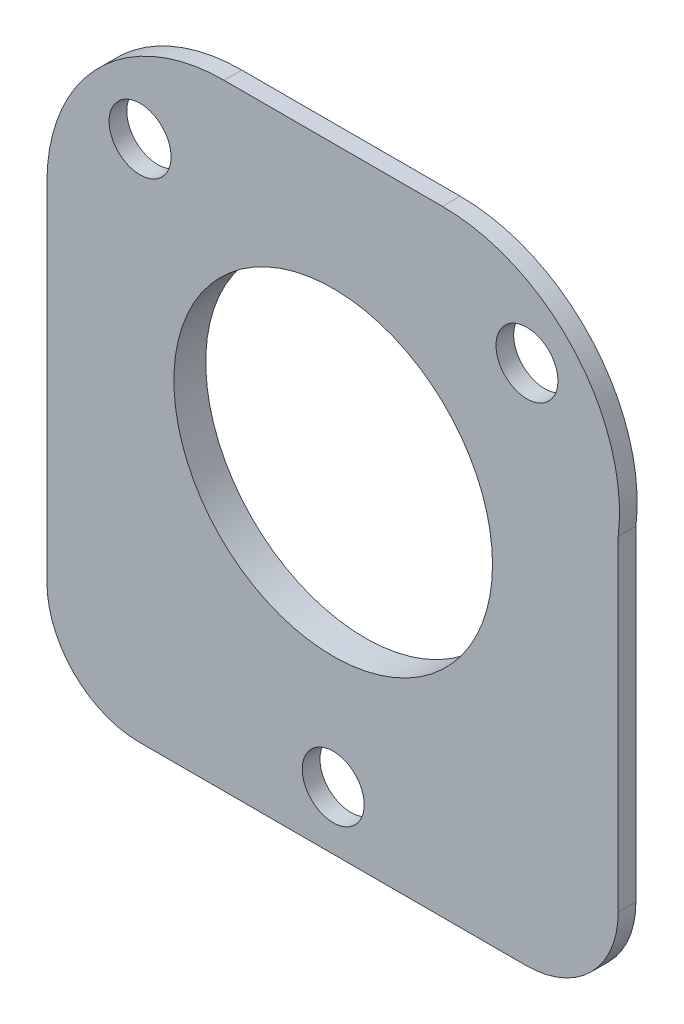
ISO-10303-21;
HEADER;
FILE_DESCRIPTION(('STEP AP214'),'2;1');
FILE_NAME('part.step','',(''),(''),'','','');
FILE_SCHEMA(('AUTOMOTIVE_DESIGN { 1 0 10303 214 1 1 1 1 }'));
ENDSEC;
DATA;
#1=APPLICATION_CONTEXT('core data for automotive mechanical design processes');
#2=APPLICATION_PROTOCOL_DEFINITION('international standard','automotive_design',2000,#1);
#3=PRODUCT_CONTEXT('',#1,'mechanical');
#4=PRODUCT('Part','Part','',(#3));
#5=PRODUCT_RELATED_PRODUCT_CATEGORY('part','',(#4));
#6=PRODUCT_DEFINITION_FORMATION('','',#4);
#7=PRODUCT_DEFINITION_CONTEXT('part definition',#1,'design');
#8=PRODUCT_DEFINITION('design','',#6,#7);
#9=PRODUCT_DEFINITION_SHAPE('','',#8);
#10=(LENGTH_UNIT() NAMED_UNIT(*) SI_UNIT(.MILLI.,.METRE.));
#11=(NAMED_UNIT(*) PLANE_ANGLE_UNIT() SI_UNIT($,.RADIAN.));
#12=(NAMED_UNIT(*) SI_UNIT($,.STERADIAN.) SOLID_ANGLE_UNIT());
#13=UNCERTAINTY_MEASURE_WITH_UNIT(LENGTH_MEASURE(1.E-05),#10,'distance_accuracy_value','');
#14=(GEOMETRIC_REPRESENTATION_CONTEXT(3) GLOBAL_UNCERTAINTY_ASSIGNED_CONTEXT((#13)) GLOBAL_UNIT_ASSIGNED_CONTEXT((#10,
#11,#12)) REPRESENTATION_CONTEXT('',''));
#15=CARTESIAN_POINT('',(0.,0.,0.));
#16=DIRECTION('',(0.,0.,1.));
#17=DIRECTION('',(1.,0.,0.));
#18=AXIS2_PLACEMENT_3D('',#15,#16,#17);
#19=CARTESIAN_POINT('',(0.,-18.6770022214594,1.));
#20=DIRECTION('',(0.,1.,0.));
#21=DIRECTION('',(0.,0.,1.));
#22=AXIS2_PLACEMENT_3D('',#19,#20,#21);
#23=PLANE('',#22);
#24=DIRECTION('',(1.,0.,0.));
#25=VECTOR('',#24,1.);
#26=CARTESIAN_POINT('',(0.,-18.6770022214594,0.));
#27=LINE('',#26,#25);
#28=CARTESIAN_POINT('',(-10.957517396478,-18.6770022214594,0.));
#29=VERTEX_POINT('',#28);
#30=CARTESIAN_POINT('',(10.8862060718335,-18.6770022214594,0.));
#31=VERTEX_POINT('',#30);
#32=EDGE_CURVE('E144',#29,#31,#27,.T.);
#33=ORIENTED_EDGE('',*,*,#32,.T.);
#34=DIRECTION('',(0.,0.,-1.));
#35=VECTOR('',#34,1.);
#36=CARTESIAN_POINT('',(10.8862060718335,-18.6770022214594,1.));
#37=LINE('',#36,#35);
#38=CARTESIAN_POINT('',(10.8862060718335,-18.6770022214594,1.));
#39=VERTEX_POINT('',#38);
#40=EDGE_CURVE('E11',#39,#31,#37,.T.);
#41=ORIENTED_EDGE('',*,*,#40,.F.);
#42=DIRECTION('',(1.,0.,0.));
#43=VECTOR('',#42,1.);
#44=CARTESIAN_POINT('',(0.,-18.6770022214594,1.));
#45=LINE('',#44,#43);
#46=CARTESIAN_POINT('',(-10.957517396478,-18.6770022214594,1.));
#47=VERTEX_POINT('',#46);
#48=EDGE_CURVE('E189',#47,#39,#45,.T.);
#49=ORIENTED_EDGE('',*,*,#48,.F.);
#50=DIRECTION('',(0.,0.,-1.));
#51=VECTOR('',#50,1.);
#52=CARTESIAN_POINT('',(-10.957517396478,-18.6770022214594,1.));
#53=LINE('',#52,#51);
#54=EDGE_CURVE('E130',#47,#29,#53,.T.);
#55=ORIENTED_EDGE('',*,*,#54,.T.);
#56=EDGE_LOOP('',(#33,#41,#49,#55));
#57=FACE_BOUND('',#56,.T.);
#58=ADVANCED_FACE('F37',(#57),#23,.F.);
#59=CARTESIAN_POINT('',(10.8862060718335,-13.4632082932929,1.));
#60=DIRECTION('',(0.,0.,-1.));
#61=DIRECTION('',(-1.,0.,0.));
#62=AXIS2_PLACEMENT_3D('',#59,#60,#61);
#63=CYLINDRICAL_SURFACE('',#62,5.21379392816652);
#64=CARTESIAN_POINT('',(10.8862060718335,-13.4632082932929,0.));
#65=DIRECTION('',(0.,0.,1.));
#66=DIRECTION('',(1.,0.,0.));
#67=AXIS2_PLACEMENT_3D('',#64,#65,#66);
#68=CIRCLE('',#67,5.21379392816652);
#69=CARTESIAN_POINT('',(16.1,-13.4632082932929,0.));
#70=VERTEX_POINT('',#69);
#71=EDGE_CURVE('E147',#31,#70,#68,.T.);
#72=ORIENTED_EDGE('',*,*,#71,.T.);
#73=DIRECTION('',(0.,0.,-1.));
#74=VECTOR('',#73,1.);
#75=CARTESIAN_POINT('',(16.1,-13.4632082932929,1.));
#76=LINE('',#75,#74);
#77=CARTESIAN_POINT('',(16.1,-13.4632082932929,1.));
#78=VERTEX_POINT('',#77);
#79=EDGE_CURVE('E46',#78,#70,#76,.T.);
#80=ORIENTED_EDGE('',*,*,#79,.F.);
#81=CARTESIAN_POINT('',(10.8862060718335,-13.4632082932929,1.));
#82=DIRECTION('',(0.,0.,1.));
#83=DIRECTION('',(1.,0.,0.));
#84=AXIS2_PLACEMENT_3D('',#81,#82,#83);
#85=CIRCLE('',#84,5.21379392816652);
#86=EDGE_CURVE('E97',#39,#78,#85,.T.);
#87=ORIENTED_EDGE('',*,*,#86,.F.);
#88=ORIENTED_EDGE('',*,*,#40,.T.);
#89=EDGE_LOOP('',(#72,#80,#87,#88));
#90=FACE_BOUND('',#89,.T.);
#91=ADVANCED_FACE('F235',(#90),#63,.T.);
#92=CARTESIAN_POINT('',(16.1,0.,1.));
#93=DIRECTION('',(-1.,0.,0.));
#94=DIRECTION('',(0.,0.,1.));
#95=AXIS2_PLACEMENT_3D('',#92,#93,#94);
#96=PLANE('',#95);
#97=DIRECTION('',(0.,1.,0.));
#98=VECTOR('',#97,1.);
#99=CARTESIAN_POINT('',(16.1,0.,0.));
#100=LINE('',#99,#98);
#101=CARTESIAN_POINT('',(16.1,4.90788373559151,0.));
#102=VERTEX_POINT('',#101);
#103=EDGE_CURVE('E149',#70,#102,#100,.T.);
#104=ORIENTED_EDGE('',*,*,#103,.T.);
#105=DIRECTION('',(0.,0.,-1.));
#106=VECTOR('',#105,1.);
#107=CARTESIAN_POINT('',(16.1,4.90788373559151,1.));
#108=LINE('',#107,#106);
#109=CARTESIAN_POINT('',(16.1,4.90788373559151,1.));
#110=VERTEX_POINT('',#109);
#111=EDGE_CURVE('E166',#110,#102,#108,.T.);
#112=ORIENTED_EDGE('',*,*,#111,.F.);
#113=DIRECTION('',(0.,1.,0.));
#114=VECTOR('',#113,1.);
#115=CARTESIAN_POINT('',(16.1,0.,1.));
#116=LINE('',#115,#114);
#117=EDGE_CURVE('E174',#78,#110,#116,.T.);
#118=ORIENTED_EDGE('',*,*,#117,.F.);
#119=ORIENTED_EDGE('',*,*,#79,.T.);
#120=EDGE_LOOP('',(#104,#112,#118,#119));
#121=FACE_BOUND('',#120,.T.);
#122=ADVANCED_FACE('F172',(#121),#96,.F.);
#123=CARTESIAN_POINT('',(6.17131132464449,6.1,1.));
#124=DIRECTION('',(0.,0.,-1.));
#125=DIRECTION('',(-1.,0.,0.));
#126=AXIS2_PLACEMENT_3D('',#123,#124,#125);
#127=CYLINDRICAL_SURFACE('',#126,10.);
#128=CARTESIAN_POINT('',(6.17131132464449,6.1,0.));
#129=DIRECTION('',(0.,0.,1.));
#130=DIRECTION('',(1.,0.,0.));
#131=AXIS2_PLACEMENT_3D('',#128,#129,#130);
#132=CIRCLE('',#131,10.);
#133=CARTESIAN_POINT('',(6.17131132464449,16.1,0.));
#134=VERTEX_POINT('',#133);
#135=EDGE_CURVE('E151',#102,#134,#132,.T.);
#136=ORIENTED_EDGE('',*,*,#135,.T.);
#137=DIRECTION('',(0.,0.,-1.));
#138=VECTOR('',#137,1.);
#139=CARTESIAN_POINT('',(6.17131132464449,16.1,1.));
#140=LINE('',#139,#138);
#141=CARTESIAN_POINT('',(6.17131132464449,16.1,1.));
#142=VERTEX_POINT('',#141);
#143=EDGE_CURVE('E164',#142,#134,#140,.T.);
#144=ORIENTED_EDGE('',*,*,#143,.F.);
#145=CARTESIAN_POINT('',(6.17131132464449,6.1,1.));
#146=DIRECTION('',(0.,0.,1.));
#147=DIRECTION('',(1.,0.,0.));
#148=AXIS2_PLACEMENT_3D('',#145,#146,#147);
#149=CIRCLE('',#148,10.);
#150=EDGE_CURVE('E184',#110,#142,#149,.T.);
#151=ORIENTED_EDGE('',*,*,#150,.F.);
#152=ORIENTED_EDGE('',*,*,#111,.T.);
#153=EDGE_LOOP('',(#136,#144,#151,#152));
#154=FACE_BOUND('',#153,.T.);
#155=ADVANCED_FACE('F182',(#154),#127,.T.);
#156=CARTESIAN_POINT('',(0.,16.1,1.));
#157=DIRECTION('',(0.,1.,0.));
#158=DIRECTION('',(0.,0.,1.));
#159=AXIS2_PLACEMENT_3D('',#156,#157,#158);
#160=PLANE('',#159);
#161=DIRECTION('',(1.,0.,0.));
#162=VECTOR('',#161,1.);
#163=CARTESIAN_POINT('',(0.,16.1,0.));
#164=LINE('',#163,#162);
#165=CARTESIAN_POINT('',(-6.17131132464449,16.1,0.));
#166=VERTEX_POINT('',#165);
#167=EDGE_CURVE('E154',#166,#134,#164,.T.);
#168=ORIENTED_EDGE('',*,*,#167,.F.);
#169=DIRECTION('',(0.,0.,-1.));
#170=VECTOR('',#169,1.);
#171=CARTESIAN_POINT('',(-6.17131132464449,16.1,1.));
#172=LINE('',#171,#170);
#173=CARTESIAN_POINT('',(-6.17131132464449,16.1,1.));
#174=VERTEX_POINT('',#173);
#175=EDGE_CURVE('E125',#174,#166,#172,.T.);
#176=ORIENTED_EDGE('',*,*,#175,.F.);
#177=DIRECTION('',(1.,0.,0.));
#178=VECTOR('',#177,1.);
#179=CARTESIAN_POINT('',(0.,16.1,1.));
#180=LINE('',#179,#178);
#181=EDGE_CURVE('E118',#174,#142,#180,.T.);
#182=ORIENTED_EDGE('',*,*,#181,.T.);
#183=ORIENTED_EDGE('',*,*,#143,.T.);
#184=EDGE_LOOP('',(#168,#176,#182,#183));
#185=FACE_BOUND('',#184,.T.);
#186=ADVANCED_FACE('F334',(#185),#160,.T.);
#187=CARTESIAN_POINT('',(-6.17131132464449,6.1,1.));
#188=DIRECTION('',(0.,0.,-1.));
#189=DIRECTION('',(-1.,0.,0.));
#190=AXIS2_PLACEMENT_3D('',#187,#188,#189);
#191=CYLINDRICAL_SURFACE('',#190,10.);
#192=CARTESIAN_POINT('',(-6.17131132464449,6.1,0.));
#193=DIRECTION('',(0.,0.,1.));
#194=DIRECTION('',(1.,0.,0.));
#195=AXIS2_PLACEMENT_3D('',#192,#193,#194);
#196=CIRCLE('',#195,10.);
#197=CARTESIAN_POINT('',(-16.1713113246445,6.09999999999993,0.));
#198=VERTEX_POINT('',#197);
#199=EDGE_CURVE('E124',#166,#198,#196,.T.);
#200=ORIENTED_EDGE('',*,*,#199,.T.);
#201=DIRECTION('',(0.,0.,-1.));
#202=VECTOR('',#201,1.);
#203=CARTESIAN_POINT('',(-16.1713113246445,6.09999999999993,1.));
#204=LINE('',#203,#202);
#205=CARTESIAN_POINT('',(-16.1713113246445,6.09999999999993,1.));
#206=VERTEX_POINT('',#205);
#207=EDGE_CURVE('E121',#206,#198,#204,.T.);
#208=ORIENTED_EDGE('',*,*,#207,.F.);
#209=CARTESIAN_POINT('',(-6.17131132464449,6.1,1.));
#210=DIRECTION('',(0.,0.,1.));
#211=DIRECTION('',(1.,0.,0.));
#212=AXIS2_PLACEMENT_3D('',#209,#210,#211);
#213=CIRCLE('',#212,10.);
#214=EDGE_CURVE('E111',#174,#206,#213,.T.);
#215=ORIENTED_EDGE('',*,*,#214,.F.);
#216=ORIENTED_EDGE('',*,*,#175,.T.);
#217=EDGE_LOOP('',(#200,#208,#215,#216));
#218=FACE_BOUND('',#217,.T.);
#219=ADVANCED_FACE('F122',(#218),#191,.T.);
#220=CARTESIAN_POINT('',(-16.1713113246445,0.,1.));
#221=DIRECTION('',(1.,0.,0.));
#222=DIRECTION('',(0.,0.,-1.));
#223=AXIS2_PLACEMENT_3D('',#220,#221,#222);
#224=PLANE('',#223);
#225=DIRECTION('',(0.,-1.,0.));
#226=VECTOR('',#225,1.);
#227=CARTESIAN_POINT('',(-16.1713113246445,0.,0.));
#228=LINE('',#227,#226);
#229=CARTESIAN_POINT('',(-16.1713113246445,-13.4632082932929,0.));
#230=VERTEX_POINT('',#229);
#231=EDGE_CURVE('E83',#198,#230,#228,.T.);
#232=ORIENTED_EDGE('',*,*,#231,.T.);
#233=DIRECTION('',(0.,0.,-1.));
#234=VECTOR('',#233,1.);
#235=CARTESIAN_POINT('',(-16.1713113246445,-13.4632082932929,1.));
#236=LINE('',#235,#234);
#237=CARTESIAN_POINT('',(-16.1713113246445,-13.4632082932929,1.));
#238=VERTEX_POINT('',#237);
#239=EDGE_CURVE('E126',#238,#230,#236,.T.);
#240=ORIENTED_EDGE('',*,*,#239,.F.);
#241=DIRECTION('',(0.,-1.,0.));
#242=VECTOR('',#241,1.);
#243=CARTESIAN_POINT('',(-16.1713113246445,0.,1.));
#244=LINE('',#243,#242);
#245=EDGE_CURVE('E116',#206,#238,#244,.T.);
#246=ORIENTED_EDGE('',*,*,#245,.F.);
#247=ORIENTED_EDGE('',*,*,#207,.T.);
#248=EDGE_LOOP('',(#232,#240,#246,#247));
#249=FACE_BOUND('',#248,.T.);
#250=ADVANCED_FACE('F128',(#249),#224,.F.);
#251=CARTESIAN_POINT('',(-10.9107197436623,10.8519646008193,1.));
#252=DIRECTION('',(0.,0.,-1.));
#253=DIRECTION('',(-1.,0.,0.));
#254=AXIS2_PLACEMENT_3D('',#251,#252,#253);
#255=CYLINDRICAL_SURFACE('',#254,1.75);
#256=CARTESIAN_POINT('',(-10.9107197436623,10.8519646008193,1.));
#257=DIRECTION('',(0.,0.,1.));
#258=DIRECTION('',(1.,0.,0.));
#259=AXIS2_PLACEMENT_3D('',#256,#257,#258);
#260=CIRCLE('',#259,1.75);
#261=CARTESIAN_POINT('',(-9.16071974366226,10.8519646008193,1.));
#262=VERTEX_POINT('',#261);
#263=EDGE_CURVE('E191',#262,#262,#260,.T.);
#264=ORIENTED_EDGE('',*,*,#263,.T.);
#265=EDGE_LOOP('',(#264));
#266=FACE_BOUND('',#265,.T.);
#267=CARTESIAN_POINT('',(-10.9107197436623,10.8519646008193,0.));
#268=DIRECTION('',(0.,0.,1.));
#269=DIRECTION('',(1.,0.,0.));
#270=AXIS2_PLACEMENT_3D('',#267,#268,#269);
#271=CIRCLE('',#270,1.75);
#272=CARTESIAN_POINT('',(-9.16071974366226,10.8519646008193,0.));
#273=VERTEX_POINT('',#272);
#274=EDGE_CURVE('E141',#273,#273,#271,.T.);
#275=ORIENTED_EDGE('',*,*,#274,.F.);
#276=EDGE_LOOP('',(#275));
#277=FACE_BOUND('',#276,.T.);
#278=ADVANCED_FACE('F244',(#266,#277),#255,.F.);
#279=CARTESIAN_POINT('',(10.9444590620381,10.8179926058548,1.));
#280=DIRECTION('',(0.,0.,-1.));
#281=DIRECTION('',(-1.,0.,0.));
#282=AXIS2_PLACEMENT_3D('',#279,#280,#281);
#283=CYLINDRICAL_SURFACE('',#282,1.75);
#284=CARTESIAN_POINT('',(10.9444590620381,10.8179926058548,1.));
#285=DIRECTION('',(0.,0.,1.));
#286=DIRECTION('',(1.,0.,0.));
#287=AXIS2_PLACEMENT_3D('',#284,#285,#286);
#288=CIRCLE('',#287,1.75);
#289=CARTESIAN_POINT('',(12.6944590620381,10.8179926058548,1.));
#290=VERTEX_POINT('',#289);
#291=EDGE_CURVE('E194',#290,#290,#288,.T.);
#292=ORIENTED_EDGE('',*,*,#291,.T.);
#293=EDGE_LOOP('',(#292));
#294=FACE_BOUND('',#293,.T.);
#295=CARTESIAN_POINT('',(10.9444590620381,10.8179926058548,0.));
#296=DIRECTION('',(0.,0.,1.));
#297=DIRECTION('',(1.,0.,0.));
#298=AXIS2_PLACEMENT_3D('',#295,#296,#297);
#299=CIRCLE('',#298,1.75);
#300=CARTESIAN_POINT('',(12.6944590620381,10.8179926058548,0.));
#301=VERTEX_POINT('',#300);
#302=EDGE_CURVE('E137',#301,#301,#299,.T.);
#303=ORIENTED_EDGE('',*,*,#302,.F.);
#304=EDGE_LOOP('',(#303));
#305=FACE_BOUND('',#304,.T.);
#306=ADVANCED_FACE('F246',(#294,#305),#283,.F.);
#307=CARTESIAN_POINT('',(0.,-15.3885977601007,1.));
#308=DIRECTION('',(0.,0.,-1.));
#309=DIRECTION('',(-1.,0.,0.));
#310=AXIS2_PLACEMENT_3D('',#307,#308,#309);
#311=CYLINDRICAL_SURFACE('',#310,1.75);
#312=CARTESIAN_POINT('',(0.,-15.3885977601007,1.));
#313=DIRECTION('',(0.,0.,1.));
#314=DIRECTION('',(1.,0.,0.));
#315=AXIS2_PLACEMENT_3D('',#312,#313,#314);
#316=CIRCLE('',#315,1.75);
#317=CARTESIAN_POINT('',(1.75,-15.3885977601007,1.));
#318=VERTEX_POINT('',#317);
#319=EDGE_CURVE('E160',#318,#318,#316,.T.);
#320=ORIENTED_EDGE('',*,*,#319,.T.);
#321=EDGE_LOOP('',(#320));
#322=FACE_BOUND('',#321,.T.);
#323=CARTESIAN_POINT('',(0.,-15.3885977601007,0.));
#324=DIRECTION('',(0.,0.,1.));
#325=DIRECTION('',(1.,0.,0.));
#326=AXIS2_PLACEMENT_3D('',#323,#324,#325);
#327=CIRCLE('',#326,1.75);
#328=CARTESIAN_POINT('',(1.75,-15.3885977601007,0.));
#329=VERTEX_POINT('',#328);
#330=EDGE_CURVE('E134',#329,#329,#327,.T.);
#331=ORIENTED_EDGE('',*,*,#330,.F.);
#332=EDGE_LOOP('',(#331));
#333=FACE_BOUND('',#332,.T.);
#334=ADVANCED_FACE('F39',(#322,#333),#311,.F.);
#335=CARTESIAN_POINT('',(-10.957517396478,-13.4632082932929,1.));
#336=DIRECTION('',(0.,0.,-1.));
#337=DIRECTION('',(-1.,0.,0.));
#338=AXIS2_PLACEMENT_3D('',#335,#336,#337);
#339=CYLINDRICAL_SURFACE('',#338,5.21379392816652);
#340=CARTESIAN_POINT('',(-10.957517396478,-13.4632082932929,0.));
#341=DIRECTION('',(0.,0.,1.));
#342=DIRECTION('',(1.,0.,0.));
#343=AXIS2_PLACEMENT_3D('',#340,#341,#342);
#344=CIRCLE('',#343,5.21379392816652);
#345=EDGE_CURVE('E89',#230,#29,#344,.T.);
#346=ORIENTED_EDGE('',*,*,#345,.T.);
#347=ORIENTED_EDGE('',*,*,#54,.F.);
#348=CARTESIAN_POINT('',(-10.957517396478,-13.4632082932929,1.));
#349=DIRECTION('',(0.,0.,1.));
#350=DIRECTION('',(1.,0.,0.));
#351=AXIS2_PLACEMENT_3D('',#348,#349,#350);
#352=CIRCLE('',#351,5.21379392816652);
#353=EDGE_CURVE('E54',#238,#47,#352,.T.);
#354=ORIENTED_EDGE('',*,*,#353,.F.);
#355=ORIENTED_EDGE('',*,*,#239,.T.);
#356=EDGE_LOOP('',(#346,#347,#354,#355));
#357=FACE_BOUND('',#356,.T.);
#358=ADVANCED_FACE('F220',(#357),#339,.T.);
#359=CARTESIAN_POINT('',(0.,0.,1.));
#360=DIRECTION('',(0.,0.,1.));
#361=DIRECTION('',(1.,0.,0.));
#362=AXIS2_PLACEMENT_3D('',#359,#360,#361);
#363=PLANE('',#362);
#364=ORIENTED_EDGE('',*,*,#319,.F.);
#365=EDGE_LOOP('',(#364));
#366=FACE_BOUND('',#365,.T.);
#367=ORIENTED_EDGE('',*,*,#291,.F.);
#368=EDGE_LOOP('',(#367));
#369=FACE_BOUND('',#368,.T.);
#370=ORIENTED_EDGE('',*,*,#263,.F.);
#371=EDGE_LOOP('',(#370));
#372=FACE_BOUND('',#371,.T.);
#373=ORIENTED_EDGE('',*,*,#48,.T.);
#374=ORIENTED_EDGE('',*,*,#86,.T.);
#375=ORIENTED_EDGE('',*,*,#117,.T.);
#376=ORIENTED_EDGE('',*,*,#150,.T.);
#377=ORIENTED_EDGE('',*,*,#181,.F.);
#378=ORIENTED_EDGE('',*,*,#214,.T.);
#379=ORIENTED_EDGE('',*,*,#245,.T.);
#380=ORIENTED_EDGE('',*,*,#353,.T.);
#381=EDGE_LOOP('',(#373,#374,#375,#376,#377,#378,#379,#380));
#382=FACE_BOUND('',#381,.T.);
#383=CARTESIAN_POINT('',(0.,0.,1.));
#384=DIRECTION('',(0.,0.,1.));
#385=DIRECTION('',(1.,0.,0.));
#386=AXIS2_PLACEMENT_3D('',#383,#384,#385);
#387=CIRCLE('',#386,9.);
#388=CARTESIAN_POINT('',(9.,0.,1.));
#389=VERTEX_POINT('',#388);
#390=EDGE_CURVE('E205',#389,#389,#387,.T.);
#391=ORIENTED_EDGE('',*,*,#390,.F.);
#392=EDGE_LOOP('',(#391));
#393=FACE_BOUND('',#392,.T.);
#394=ADVANCED_FACE('F113',(#366,#369,#372,#382,#393),#363,.T.);
#395=CARTESIAN_POINT('',(0.,0.,0.));
#396=DIRECTION('',(0.,0.,1.));
#397=DIRECTION('',(1.,0.,0.));
#398=AXIS2_PLACEMENT_3D('',#395,#396,#397);
#399=PLANE('',#398);
#400=ORIENTED_EDGE('',*,*,#330,.T.);
#401=EDGE_LOOP('',(#400));
#402=FACE_BOUND('',#401,.T.);
#403=ORIENTED_EDGE('',*,*,#302,.T.);
#404=EDGE_LOOP('',(#403));
#405=FACE_BOUND('',#404,.T.);
#406=ORIENTED_EDGE('',*,*,#274,.T.);
#407=EDGE_LOOP('',(#406));
#408=FACE_BOUND('',#407,.T.);
#409=CARTESIAN_POINT('',(0.,0.,0.));
#410=DIRECTION('',(0.,0.,1.));
#411=DIRECTION('',(1.,0.,0.));
#412=AXIS2_PLACEMENT_3D('',#409,#410,#411);
#413=CIRCLE('',#412,12.1);
#414=CARTESIAN_POINT('',(12.1,0.,0.));
#415=VERTEX_POINT('',#414);
#416=EDGE_CURVE('E138',#415,#415,#413,.T.);
#417=ORIENTED_EDGE('',*,*,#416,.T.);
#418=EDGE_LOOP('',(#417));
#419=FACE_BOUND('',#418,.T.);
#420=ORIENTED_EDGE('',*,*,#32,.F.);
#421=ORIENTED_EDGE('',*,*,#345,.F.);
#422=ORIENTED_EDGE('',*,*,#231,.F.);
#423=ORIENTED_EDGE('',*,*,#199,.F.);
#424=ORIENTED_EDGE('',*,*,#167,.T.);
#425=ORIENTED_EDGE('',*,*,#135,.F.);
#426=ORIENTED_EDGE('',*,*,#103,.F.);
#427=ORIENTED_EDGE('',*,*,#71,.F.);
#428=EDGE_LOOP('',(#420,#421,#422,#423,#424,#425,#426,#427));
#429=FACE_BOUND('',#428,.T.);
#430=ADVANCED_FACE('F178',(#402,#405,#408,#419,#429),#399,.F.);
#431=CARTESIAN_POINT('',(0.,0.,-0.8));
#432=DIRECTION('',(0.,0.,1.));
#433=DIRECTION('',(1.,0.,0.));
#434=AXIS2_PLACEMENT_3D('',#431,#432,#433);
#435=CYLINDRICAL_SURFACE('',#434,12.1);
#436=CARTESIAN_POINT('',(0.,0.,-0.8));
#437=DIRECTION('',(0.,0.,1.));
#438=DIRECTION('',(1.,0.,0.));
#439=AXIS2_PLACEMENT_3D('',#436,#437,#438);
#440=CIRCLE('',#439,12.1);
#441=CARTESIAN_POINT('',(12.1,0.,-0.8));
#442=VERTEX_POINT('',#441);
#443=EDGE_CURVE('E201',#442,#442,#440,.T.);
#444=ORIENTED_EDGE('',*,*,#443,.T.);
#445=EDGE_LOOP('',(#444));
#446=FACE_BOUND('',#445,.T.);
#447=ORIENTED_EDGE('',*,*,#416,.F.);
#448=EDGE_LOOP('',(#447));
#449=FACE_BOUND('',#448,.T.);
#450=ADVANCED_FACE('F227',(#446,#449),#435,.T.);
#451=CARTESIAN_POINT('',(0.,0.,-0.8));
#452=DIRECTION('',(0.,0.,1.));
#453=DIRECTION('',(1.,0.,0.));
#454=AXIS2_PLACEMENT_3D('',#451,#452,#453);
#455=PLANE('',#454);
#456=CARTESIAN_POINT('',(0.,0.,-0.8));
#457=DIRECTION('',(0.,0.,1.));
#458=DIRECTION('',(1.,0.,0.));
#459=AXIS2_PLACEMENT_3D('',#456,#457,#458);
#460=CIRCLE('',#459,9.);
#461=CARTESIAN_POINT('',(9.,0.,-0.8));
#462=VERTEX_POINT('',#461);
#463=EDGE_CURVE('E204',#462,#462,#460,.T.);
#464=ORIENTED_EDGE('',*,*,#463,.T.);
#465=EDGE_LOOP('',(#464));
#466=FACE_BOUND('',#465,.T.);
#467=ORIENTED_EDGE('',*,*,#443,.F.);
#468=EDGE_LOOP('',(#467));
#469=FACE_BOUND('',#468,.T.);
#470=ADVANCED_FACE('F211',(#466,#469),#455,.F.);
#471=CARTESIAN_POINT('',(0.,0.,-0.8));
#472=DIRECTION('',(0.,0.,1.));
#473=DIRECTION('',(1.,0.,0.));
#474=AXIS2_PLACEMENT_3D('',#471,#472,#473);
#475=CYLINDRICAL_SURFACE('',#474,9.);
#476=ORIENTED_EDGE('',*,*,#463,.F.);
#477=EDGE_LOOP('',(#476));
#478=FACE_BOUND('',#477,.T.);
#479=ORIENTED_EDGE('',*,*,#390,.T.);
#480=EDGE_LOOP('',(#479));
#481=FACE_BOUND('',#480,.T.);
#482=ADVANCED_FACE('F214',(#478,#481),#475,.F.);
#483=CLOSED_SHELL('',(#58,#91,#122,#155,#186,#219,#250,#278,#306,#334,#358,#394,#430,#450,#470,#482));
#484=MANIFOLD_SOLID_BREP('B2',#483);
#485=ADVANCED_BREP_SHAPE_REPRESENTATION('',(#18,#484),#14);
#486=SHAPE_DEFINITION_REPRESENTATION(#9,#485);
ENDSEC;
END-ISO-10303-21;
